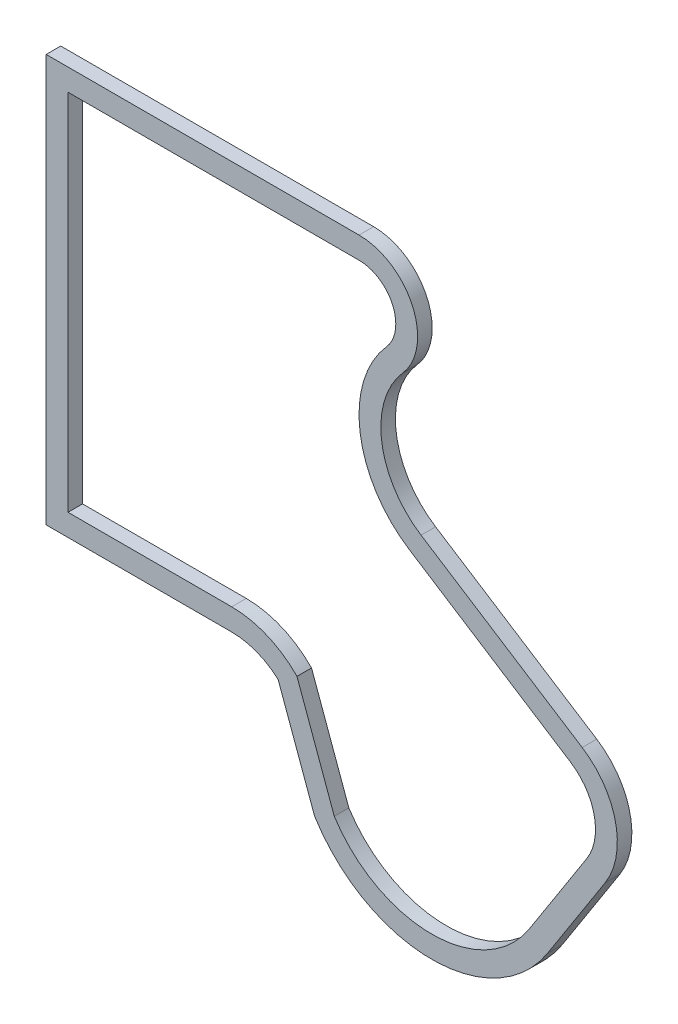
ISO-10303-21;
HEADER;
FILE_DESCRIPTION(('STEP AP214'),'2;1');
FILE_NAME('part.step','',(''),(''),'','','');
FILE_SCHEMA(('AUTOMOTIVE_DESIGN { 1 0 10303 214 1 1 1 1 }'));
ENDSEC;
DATA;
#1=APPLICATION_CONTEXT('core data for automotive mechanical design processes');
#2=APPLICATION_PROTOCOL_DEFINITION('international standard','automotive_design',2000,#1);
#3=PRODUCT_CONTEXT('',#1,'mechanical');
#4=PRODUCT('Part','Part','',(#3));
#5=PRODUCT_RELATED_PRODUCT_CATEGORY('part','',(#4));
#6=PRODUCT_DEFINITION_FORMATION('','',#4);
#7=PRODUCT_DEFINITION_CONTEXT('part definition',#1,'design');
#8=PRODUCT_DEFINITION('design','',#6,#7);
#9=PRODUCT_DEFINITION_SHAPE('','',#8);
#10=(LENGTH_UNIT() NAMED_UNIT(*) SI_UNIT(.MILLI.,.METRE.));
#11=(NAMED_UNIT(*) PLANE_ANGLE_UNIT() SI_UNIT($,.RADIAN.));
#12=(NAMED_UNIT(*) SI_UNIT($,.STERADIAN.) SOLID_ANGLE_UNIT());
#13=UNCERTAINTY_MEASURE_WITH_UNIT(LENGTH_MEASURE(1.E-05),#10,'distance_accuracy_value','');
#14=(GEOMETRIC_REPRESENTATION_CONTEXT(3) GLOBAL_UNCERTAINTY_ASSIGNED_CONTEXT((#13)) GLOBAL_UNIT_ASSIGNED_CONTEXT((#10,
#11,#12)) REPRESENTATION_CONTEXT('',''));
#15=CARTESIAN_POINT('',(0.,0.,0.));
#16=DIRECTION('',(0.,0.,1.));
#17=DIRECTION('',(1.,0.,0.));
#18=AXIS2_PLACEMENT_3D('',#15,#16,#17);
#19=CARTESIAN_POINT('',(57.15,-31.75,5.08));
#20=DIRECTION('',(0.,0.,-1.));
#21=DIRECTION('',(-1.,0.,0.));
#22=AXIS2_PLACEMENT_3D('',#19,#20,#21);
#23=PLANE('',#22);
#24=DIRECTION('',(1.,0.,0.));
#25=VECTOR('',#24,1.);
#26=CARTESIAN_POINT('',(-7.62,-7.62,5.08));
#27=LINE('',#26,#25);
#28=CARTESIAN_POINT('',(-7.62,-7.62,5.08));
#29=VERTEX_POINT('',#28);
#30=CARTESIAN_POINT('',(57.15,-7.62,5.08));
#31=VERTEX_POINT('',#30);
#32=EDGE_CURVE('E274',#29,#31,#27,.T.);
#33=ORIENTED_EDGE('',*,*,#32,.T.);
#34=CARTESIAN_POINT('',(57.15,-31.75,5.08));
#35=DIRECTION('',(0.,0.,-1.));
#36=DIRECTION('',(-1.,0.,0.));
#37=AXIS2_PLACEMENT_3D('',#34,#35,#36);
#38=CIRCLE('',#37,24.13);
#39=CARTESIAN_POINT('',(73.3701951159205,-13.8848895776861,5.08));
#40=VERTEX_POINT('',#39);
#41=EDGE_CURVE('E277',#31,#40,#38,.T.);
#42=ORIENTED_EDGE('',*,*,#41,.T.);
#43=DIRECTION('',(0.342020143325669,-0.939692620785908,0.));
#44=VECTOR('',#43,1.);
#45=CARTESIAN_POINT('',(73.3701951159205,-13.8848895776861,5.08));
#46=LINE('',#45,#44);
#47=CARTESIAN_POINT('',(86.0802479004247,-48.8054726031877,5.08));
#48=VERTEX_POINT('',#47);
#49=EDGE_CURVE('E280',#40,#48,#46,.T.);
#50=ORIENTED_EDGE('',*,*,#49,.T.);
#51=CARTESIAN_POINT('',(127.,-23.6138442919467,5.08));
#52=DIRECTION('',(0.,0.,1.));
#53=DIRECTION('',(1.,0.,0.));
#54=AXIS2_PLACEMENT_3D('',#51,#52,#53);
#55=CIRCLE('',#54,48.0525155310564);
#56=CARTESIAN_POINT('',(167.450498741756,-49.552259825776,5.08));
#57=VERTEX_POINT('',#56);
#58=EDGE_CURVE('E282',#48,#57,#55,.T.);
#59=ORIENTED_EDGE('',*,*,#58,.T.);
#60=DIRECTION('',(0.539793083612144,0.84179773513861,0.));
#61=VECTOR('',#60,1.);
#62=CARTESIAN_POINT('',(167.450498741756,-49.552259825776,5.08));
#63=LINE('',#62,#61);
#64=CARTESIAN_POINT('',(187.550745596147,-18.2062815399359,5.08));
#65=VERTEX_POINT('',#64);
#66=EDGE_CURVE('E284',#57,#65,#63,.T.);
#67=ORIENTED_EDGE('',*,*,#66,.T.);
#68=CARTESIAN_POINT('',(165.1,-3.81000000000001,5.08));
#69=DIRECTION('',(0.,0.,1.));
#70=DIRECTION('',(-1.,0.,0.));
#71=AXIS2_PLACEMENT_3D('',#68,#69,#70);
#72=CIRCLE('',#71,26.67);
#73=CARTESIAN_POINT('',(179.496281539936,18.6407455961467,5.08));
#74=VERTEX_POINT('',#73);
#75=EDGE_CURVE('E286',#65,#74,#72,.T.);
#76=ORIENTED_EDGE('',*,*,#75,.T.);
#77=DIRECTION('',(-0.84179773513861,0.539793083612144,0.));
#78=VECTOR('',#77,1.);
#79=CARTESIAN_POINT('',(123.247106811502,54.7098797953497,5.08));
#80=LINE('',#79,#78);
#81=CARTESIAN_POINT('',(123.247106811502,54.7098797953497,5.08));
#82=VERTEX_POINT('',#81);
#83=EDGE_CURVE('E288',#74,#82,#80,.T.);
#84=ORIENTED_EDGE('',*,*,#83,.T.);
#85=CARTESIAN_POINT('',(139.7,80.3678747623745,5.08));
#86=DIRECTION('',(0.,0.,-1.));
#87=DIRECTION('',(1.,0.,0.));
#88=AXIS2_PLACEMENT_3D('',#85,#86,#87);
#89=CIRCLE('',#88,30.48);
#90=CARTESIAN_POINT('',(116.899219219543,100.595449896373,5.08));
#91=VERTEX_POINT('',#90);
#92=EDGE_CURVE('E290',#82,#91,#89,.T.);
#93=ORIENTED_EDGE('',*,*,#92,.T.);
#94=CARTESIAN_POINT('',(101.6,114.168059941379,5.08));
#95=DIRECTION('',(0.,0.,1.));
#96=DIRECTION('',(-1.,0.,0.));
#97=AXIS2_PLACEMENT_3D('',#94,#95,#96);
#98=CIRCLE('',#97,20.4519400586212);
#99=CARTESIAN_POINT('',(101.6,134.62,5.08));
#100=VERTEX_POINT('',#99);
#101=EDGE_CURVE('E292',#91,#100,#98,.T.);
#102=ORIENTED_EDGE('',*,*,#101,.T.);
#103=DIRECTION('',(-1.,0.,0.));
#104=VECTOR('',#103,1.);
#105=CARTESIAN_POINT('',(-7.62,134.62,5.08));
#106=LINE('',#105,#104);
#107=CARTESIAN_POINT('',(-7.62,134.62,5.08));
#108=VERTEX_POINT('',#107);
#109=EDGE_CURVE('E294',#100,#108,#106,.T.);
#110=ORIENTED_EDGE('',*,*,#109,.T.);
#111=DIRECTION('',(0.,-1.,0.));
#112=VECTOR('',#111,1.);
#113=CARTESIAN_POINT('',(-7.62,-7.62,5.08));
#114=LINE('',#113,#112);
#115=EDGE_CURVE('E296',#108,#29,#114,.T.);
#116=ORIENTED_EDGE('',*,*,#115,.T.);
#117=EDGE_LOOP('',(#33,#42,#50,#59,#67,#76,#84,#93,#102,#110,#116));
#118=FACE_BOUND('',#117,.T.);
#119=DIRECTION('',(1.,0.,0.));
#120=VECTOR('',#119,1.);
#121=CARTESIAN_POINT('',(0.,0.,5.08));
#122=LINE('',#121,#120);
#123=CARTESIAN_POINT('',(0.,0.,5.08));
#124=VERTEX_POINT('',#123);
#125=CARTESIAN_POINT('',(57.15,0.,5.08));
#126=VERTEX_POINT('',#125);
#127=EDGE_CURVE('E188',#124,#126,#122,.T.);
#128=ORIENTED_EDGE('',*,*,#127,.F.);
#129=DIRECTION('',(0.,-1.,0.));
#130=VECTOR('',#129,1.);
#131=CARTESIAN_POINT('',(0.,0.,5.08));
#132=LINE('',#131,#130);
#133=CARTESIAN_POINT('',(0.,127.,5.08));
#134=VERTEX_POINT('',#133);
#135=EDGE_CURVE('E227',#134,#124,#132,.T.);
#136=ORIENTED_EDGE('',*,*,#135,.F.);
#137=DIRECTION('',(-1.,0.,0.));
#138=VECTOR('',#137,1.);
#139=CARTESIAN_POINT('',(0.,127.,5.08));
#140=LINE('',#139,#138);
#141=CARTESIAN_POINT('',(101.6,127.,5.08));
#142=VERTEX_POINT('',#141);
#143=EDGE_CURVE('E225',#142,#134,#140,.T.);
#144=ORIENTED_EDGE('',*,*,#143,.F.);
#145=CARTESIAN_POINT('',(101.6,114.168059941379,5.08));
#146=DIRECTION('',(0.,0.,1.));
#147=DIRECTION('',(-1.,0.,0.));
#148=AXIS2_PLACEMENT_3D('',#145,#146,#147);
#149=CIRCLE('',#148,12.8319400586212);
#150=CARTESIAN_POINT('',(111.199024024429,105.652343679872,5.08));
#151=VERTEX_POINT('',#150);
#152=EDGE_CURVE('E223',#151,#142,#149,.T.);
#153=ORIENTED_EDGE('',*,*,#152,.F.);
#154=CARTESIAN_POINT('',(139.7,80.3678747623745,5.08));
#155=DIRECTION('',(0.,0.,-1.));
#156=DIRECTION('',(1.,0.,0.));
#157=AXIS2_PLACEMENT_3D('',#154,#155,#156);
#158=CIRCLE('',#157,38.1);
#159=CARTESIAN_POINT('',(119.133883514377,48.2953810535935,5.08));
#160=VERTEX_POINT('',#159);
#161=EDGE_CURVE('E221',#160,#151,#158,.T.);
#162=ORIENTED_EDGE('',*,*,#161,.F.);
#163=DIRECTION('',(-0.84179773513861,0.539793083612144,0.));
#164=VECTOR('',#163,1.);
#165=CARTESIAN_POINT('',(119.133883514377,48.2953810535935,5.08));
#166=LINE('',#165,#164);
#167=CARTESIAN_POINT('',(175.383058242811,12.2262468543905,5.08));
#168=VERTEX_POINT('',#167);
#169=EDGE_CURVE('E219',#168,#160,#166,.T.);
#170=ORIENTED_EDGE('',*,*,#169,.F.);
#171=CARTESIAN_POINT('',(165.1,-3.81000000000001,5.08));
#172=DIRECTION('',(0.,0.,1.));
#173=DIRECTION('',(-1.,0.,0.));
#174=AXIS2_PLACEMENT_3D('',#171,#172,#173);
#175=CIRCLE('',#174,19.05);
#176=CARTESIAN_POINT('',(181.136246854391,-14.0930582428113,5.08));
#177=VERTEX_POINT('',#176);
#178=EDGE_CURVE('E217',#177,#168,#175,.T.);
#179=ORIENTED_EDGE('',*,*,#178,.F.);
#180=DIRECTION('',(0.539793083612144,0.84179773513861,0.));
#181=VECTOR('',#180,1.);
#182=CARTESIAN_POINT('',(161.036,-45.4390365286515,5.08));
#183=LINE('',#182,#181);
#184=CARTESIAN_POINT('',(161.036,-45.4390365286515,5.08));
#185=VERTEX_POINT('',#184);
#186=EDGE_CURVE('E215',#185,#177,#183,.T.);
#187=ORIENTED_EDGE('',*,*,#186,.F.);
#188=CARTESIAN_POINT('',(127.,-23.6138442919467,5.08));
#189=DIRECTION('',(0.,0.,1.));
#190=DIRECTION('',(1.,0.,0.));
#191=AXIS2_PLACEMENT_3D('',#188,#189,#190);
#192=CIRCLE('',#191,40.4325155310564);
#193=CARTESIAN_POINT('',(92.964,-45.4390365286515,5.08));
#194=VERTEX_POINT('',#193);
#195=EDGE_CURVE('E211',#194,#185,#192,.T.);
#196=ORIENTED_EDGE('',*,*,#195,.F.);
#197=DIRECTION('',(0.342020143325669,-0.939692620785908,0.));
#198=VECTOR('',#197,1.);
#199=CARTESIAN_POINT('',(79.933032539292,-9.63674767670839,5.08));
#200=LINE('',#199,#198);
#201=CARTESIAN_POINT('',(79.933032539292,-9.63674767670839,5.08));
#202=VERTEX_POINT('',#201);
#203=EDGE_CURVE('E209',#202,#194,#200,.T.);
#204=ORIENTED_EDGE('',*,*,#203,.F.);
#205=CARTESIAN_POINT('',(57.15,-31.75,5.08));
#206=DIRECTION('',(0.,0.,-1.));
#207=DIRECTION('',(-1.,0.,0.));
#208=AXIS2_PLACEMENT_3D('',#205,#206,#207);
#209=CIRCLE('',#208,31.75);
#210=EDGE_CURVE('E196',#126,#202,#209,.T.);
#211=ORIENTED_EDGE('',*,*,#210,.F.);
#212=EDGE_LOOP('',(#128,#136,#144,#153,#162,#170,#179,#187,#196,#204,#211));
#213=FACE_BOUND('',#212,.T.);
#214=ADVANCED_FACE('F39',(#118,#213),#23,.F.);
#215=CARTESIAN_POINT('',(57.15,-31.75,0.));
#216=DIRECTION('',(0.,0.,-1.));
#217=DIRECTION('',(-1.,0.,0.));
#218=AXIS2_PLACEMENT_3D('',#215,#216,#217);
#219=PLANE('',#218);
#220=DIRECTION('',(1.,0.,0.));
#221=VECTOR('',#220,1.);
#222=CARTESIAN_POINT('',(-7.62,-7.62,0.));
#223=LINE('',#222,#221);
#224=CARTESIAN_POINT('',(-7.62,-7.62,0.));
#225=VERTEX_POINT('',#224);
#226=CARTESIAN_POINT('',(57.15,-7.62,0.));
#227=VERTEX_POINT('',#226);
#228=EDGE_CURVE('E204',#225,#227,#223,.T.);
#229=ORIENTED_EDGE('',*,*,#228,.F.);
#230=DIRECTION('',(0.,-1.,0.));
#231=VECTOR('',#230,1.);
#232=CARTESIAN_POINT('',(-7.62,-7.62,0.));
#233=LINE('',#232,#231);
#234=CARTESIAN_POINT('',(-7.62,134.62,0.));
#235=VERTEX_POINT('',#234);
#236=EDGE_CURVE('E278',#235,#225,#233,.T.);
#237=ORIENTED_EDGE('',*,*,#236,.F.);
#238=DIRECTION('',(-1.,0.,0.));
#239=VECTOR('',#238,1.);
#240=CARTESIAN_POINT('',(-7.62,134.62,0.));
#241=LINE('',#240,#239);
#242=CARTESIAN_POINT('',(101.6,134.62,0.));
#243=VERTEX_POINT('',#242);
#244=EDGE_CURVE('E317',#243,#235,#241,.T.);
#245=ORIENTED_EDGE('',*,*,#244,.F.);
#246=CARTESIAN_POINT('',(101.6,114.168059941379,0.));
#247=DIRECTION('',(0.,0.,1.));
#248=DIRECTION('',(-1.,0.,0.));
#249=AXIS2_PLACEMENT_3D('',#246,#247,#248);
#250=CIRCLE('',#249,20.4519400586212);
#251=CARTESIAN_POINT('',(116.899219219543,100.595449896373,0.));
#252=VERTEX_POINT('',#251);
#253=EDGE_CURVE('E315',#252,#243,#250,.T.);
#254=ORIENTED_EDGE('',*,*,#253,.F.);
#255=CARTESIAN_POINT('',(139.7,80.3678747623745,0.));
#256=DIRECTION('',(0.,0.,-1.));
#257=DIRECTION('',(1.,0.,0.));
#258=AXIS2_PLACEMENT_3D('',#255,#256,#257);
#259=CIRCLE('',#258,30.48);
#260=CARTESIAN_POINT('',(123.247106811502,54.7098797953497,0.));
#261=VERTEX_POINT('',#260);
#262=EDGE_CURVE('E313',#261,#252,#259,.T.);
#263=ORIENTED_EDGE('',*,*,#262,.F.);
#264=DIRECTION('',(-0.84179773513861,0.539793083612144,0.));
#265=VECTOR('',#264,1.);
#266=CARTESIAN_POINT('',(123.247106811502,54.7098797953497,0.));
#267=LINE('',#266,#265);
#268=CARTESIAN_POINT('',(179.496281539936,18.6407455961467,0.));
#269=VERTEX_POINT('',#268);
#270=EDGE_CURVE('E311',#269,#261,#267,.T.);
#271=ORIENTED_EDGE('',*,*,#270,.F.);
#272=CARTESIAN_POINT('',(165.1,-3.81000000000001,0.));
#273=DIRECTION('',(0.,0.,1.));
#274=DIRECTION('',(-1.,0.,0.));
#275=AXIS2_PLACEMENT_3D('',#272,#273,#274);
#276=CIRCLE('',#275,26.67);
#277=CARTESIAN_POINT('',(187.550745596147,-18.2062815399359,0.));
#278=VERTEX_POINT('',#277);
#279=EDGE_CURVE('E309',#278,#269,#276,.T.);
#280=ORIENTED_EDGE('',*,*,#279,.F.);
#281=DIRECTION('',(0.539793083612144,0.84179773513861,0.));
#282=VECTOR('',#281,1.);
#283=CARTESIAN_POINT('',(167.450498741756,-49.552259825776,0.));
#284=LINE('',#283,#282);
#285=CARTESIAN_POINT('',(167.450498741756,-49.552259825776,0.));
#286=VERTEX_POINT('',#285);
#287=EDGE_CURVE('E307',#286,#278,#284,.T.);
#288=ORIENTED_EDGE('',*,*,#287,.F.);
#289=CARTESIAN_POINT('',(127.,-23.6138442919467,0.));
#290=DIRECTION('',(0.,0.,1.));
#291=DIRECTION('',(1.,0.,0.));
#292=AXIS2_PLACEMENT_3D('',#289,#290,#291);
#293=CIRCLE('',#292,48.0525155310564);
#294=CARTESIAN_POINT('',(86.0802479004247,-48.8054726031877,0.));
#295=VERTEX_POINT('',#294);
#296=EDGE_CURVE('E305',#295,#286,#293,.T.);
#297=ORIENTED_EDGE('',*,*,#296,.F.);
#298=DIRECTION('',(0.342020143325669,-0.939692620785908,0.));
#299=VECTOR('',#298,1.);
#300=CARTESIAN_POINT('',(73.3701951159205,-13.8848895776861,0.));
#301=LINE('',#300,#299);
#302=CARTESIAN_POINT('',(73.3701951159205,-13.8848895776861,0.));
#303=VERTEX_POINT('',#302);
#304=EDGE_CURVE('E303',#303,#295,#301,.T.);
#305=ORIENTED_EDGE('',*,*,#304,.F.);
#306=CARTESIAN_POINT('',(57.15,-31.75,0.));
#307=DIRECTION('',(0.,0.,-1.));
#308=DIRECTION('',(-1.,0.,0.));
#309=AXIS2_PLACEMENT_3D('',#306,#307,#308);
#310=CIRCLE('',#309,24.13);
#311=EDGE_CURVE('E301',#227,#303,#310,.T.);
#312=ORIENTED_EDGE('',*,*,#311,.F.);
#313=EDGE_LOOP('',(#229,#237,#245,#254,#263,#271,#280,#288,#297,#305,#312));
#314=FACE_BOUND('',#313,.T.);
#315=DIRECTION('',(0.,-1.,0.));
#316=VECTOR('',#315,1.);
#317=CARTESIAN_POINT('',(0.,0.,0.));
#318=LINE('',#317,#316);
#319=CARTESIAN_POINT('',(0.,127.,0.));
#320=VERTEX_POINT('',#319);
#321=CARTESIAN_POINT('',(0.,0.,0.));
#322=VERTEX_POINT('',#321);
#323=EDGE_CURVE('E197',#320,#322,#318,.T.);
#324=ORIENTED_EDGE('',*,*,#323,.T.);
#325=DIRECTION('',(1.,0.,0.));
#326=VECTOR('',#325,1.);
#327=CARTESIAN_POINT('',(0.,0.,0.));
#328=LINE('',#327,#326);
#329=CARTESIAN_POINT('',(57.15,0.,0.));
#330=VERTEX_POINT('',#329);
#331=EDGE_CURVE('E62',#322,#330,#328,.T.);
#332=ORIENTED_EDGE('',*,*,#331,.T.);
#333=CARTESIAN_POINT('',(57.15,-31.75,0.));
#334=DIRECTION('',(0.,0.,-1.));
#335=DIRECTION('',(-1.,0.,0.));
#336=AXIS2_PLACEMENT_3D('',#333,#334,#335);
#337=CIRCLE('',#336,31.75);
#338=CARTESIAN_POINT('',(79.933032539292,-9.63674767670839,0.));
#339=VERTEX_POINT('',#338);
#340=EDGE_CURVE('E203',#330,#339,#337,.T.);
#341=ORIENTED_EDGE('',*,*,#340,.T.);
#342=DIRECTION('',(0.342020143325669,-0.939692620785908,0.));
#343=VECTOR('',#342,1.);
#344=CARTESIAN_POINT('',(79.933032539292,-9.63674767670839,0.));
#345=LINE('',#344,#343);
#346=CARTESIAN_POINT('',(92.964,-45.4390365286515,0.));
#347=VERTEX_POINT('',#346);
#348=EDGE_CURVE('E231',#339,#347,#345,.T.);
#349=ORIENTED_EDGE('',*,*,#348,.T.);
#350=CARTESIAN_POINT('',(127.,-23.6138442919467,0.));
#351=DIRECTION('',(0.,0.,1.));
#352=DIRECTION('',(1.,0.,0.));
#353=AXIS2_PLACEMENT_3D('',#350,#351,#352);
#354=CIRCLE('',#353,40.4325155310564);
#355=CARTESIAN_POINT('',(161.036,-45.4390365286515,0.));
#356=VERTEX_POINT('',#355);
#357=EDGE_CURVE('E234',#347,#356,#354,.T.);
#358=ORIENTED_EDGE('',*,*,#357,.T.);
#359=DIRECTION('',(0.539793083612144,0.84179773513861,0.));
#360=VECTOR('',#359,1.);
#361=CARTESIAN_POINT('',(161.036,-45.4390365286515,0.));
#362=LINE('',#361,#360);
#363=CARTESIAN_POINT('',(181.136246854391,-14.0930582428113,0.));
#364=VERTEX_POINT('',#363);
#365=EDGE_CURVE('E237',#356,#364,#362,.T.);
#366=ORIENTED_EDGE('',*,*,#365,.T.);
#367=CARTESIAN_POINT('',(165.1,-3.81000000000001,0.));
#368=DIRECTION('',(0.,0.,1.));
#369=DIRECTION('',(-1.,0.,0.));
#370=AXIS2_PLACEMENT_3D('',#367,#368,#369);
#371=CIRCLE('',#370,19.05);
#372=CARTESIAN_POINT('',(175.383058242811,12.2262468543905,0.));
#373=VERTEX_POINT('',#372);
#374=EDGE_CURVE('E240',#364,#373,#371,.T.);
#375=ORIENTED_EDGE('',*,*,#374,.T.);
#376=DIRECTION('',(-0.84179773513861,0.539793083612144,0.));
#377=VECTOR('',#376,1.);
#378=CARTESIAN_POINT('',(119.133883514377,48.2953810535935,0.));
#379=LINE('',#378,#377);
#380=CARTESIAN_POINT('',(119.133883514377,48.2953810535935,0.));
#381=VERTEX_POINT('',#380);
#382=EDGE_CURVE('E243',#373,#381,#379,.T.);
#383=ORIENTED_EDGE('',*,*,#382,.T.);
#384=CARTESIAN_POINT('',(139.7,80.3678747623745,0.));
#385=DIRECTION('',(0.,0.,-1.));
#386=DIRECTION('',(1.,0.,0.));
#387=AXIS2_PLACEMENT_3D('',#384,#385,#386);
#388=CIRCLE('',#387,38.1);
#389=CARTESIAN_POINT('',(111.199024024429,105.652343679872,0.));
#390=VERTEX_POINT('',#389);
#391=EDGE_CURVE('E246',#381,#390,#388,.T.);
#392=ORIENTED_EDGE('',*,*,#391,.T.);
#393=CARTESIAN_POINT('',(101.6,114.168059941379,0.));
#394=DIRECTION('',(0.,0.,1.));
#395=DIRECTION('',(-1.,0.,0.));
#396=AXIS2_PLACEMENT_3D('',#393,#394,#395);
#397=CIRCLE('',#396,12.8319400586212);
#398=CARTESIAN_POINT('',(101.6,127.,0.));
#399=VERTEX_POINT('',#398);
#400=EDGE_CURVE('E249',#390,#399,#397,.T.);
#401=ORIENTED_EDGE('',*,*,#400,.T.);
#402=DIRECTION('',(-1.,0.,0.));
#403=VECTOR('',#402,1.);
#404=CARTESIAN_POINT('',(0.,127.,0.));
#405=LINE('',#404,#403);
#406=EDGE_CURVE('E252',#399,#320,#405,.T.);
#407=ORIENTED_EDGE('',*,*,#406,.T.);
#408=EDGE_LOOP('',(#324,#332,#341,#349,#358,#366,#375,#383,#392,#401,#407));
#409=FACE_BOUND('',#408,.T.);
#410=ADVANCED_FACE('F356',(#314,#409),#219,.T.);
#411=CARTESIAN_POINT('',(-7.62,-7.62,5.08));
#412=DIRECTION('',(0.,1.,0.));
#413=DIRECTION('',(-1.,0.,0.));
#414=AXIS2_PLACEMENT_3D('',#411,#412,#413);
#415=PLANE('',#414);
#416=ORIENTED_EDGE('',*,*,#228,.T.);
#417=DIRECTION('',(0.,0.,-1.));
#418=VECTOR('',#417,1.);
#419=CARTESIAN_POINT('',(57.15,-7.62,5.08));
#420=LINE('',#419,#418);
#421=EDGE_CURVE('E11',#31,#227,#420,.T.);
#422=ORIENTED_EDGE('',*,*,#421,.F.);
#423=ORIENTED_EDGE('',*,*,#32,.F.);
#424=DIRECTION('',(0.,0.,-1.));
#425=VECTOR('',#424,1.);
#426=CARTESIAN_POINT('',(-7.62,-7.62,5.08));
#427=LINE('',#426,#425);
#428=EDGE_CURVE('E298',#29,#225,#427,.T.);
#429=ORIENTED_EDGE('',*,*,#428,.T.);
#430=EDGE_LOOP('',(#416,#422,#423,#429));
#431=FACE_BOUND('',#430,.T.);
#432=ADVANCED_FACE('F41',(#431),#415,.F.);
#433=CARTESIAN_POINT('',(57.15,-31.75,5.08));
#434=DIRECTION('',(0.,0.,-1.));
#435=DIRECTION('',(-1.,0.,0.));
#436=AXIS2_PLACEMENT_3D('',#433,#434,#435);
#437=CYLINDRICAL_SURFACE('',#436,24.13);
#438=ORIENTED_EDGE('',*,*,#311,.T.);
#439=DIRECTION('',(0.,0.,-1.));
#440=VECTOR('',#439,1.);
#441=CARTESIAN_POINT('',(73.3701951159205,-13.8848895776861,5.08));
#442=LINE('',#441,#440);
#443=EDGE_CURVE('E47',#40,#303,#442,.T.);
#444=ORIENTED_EDGE('',*,*,#443,.F.);
#445=ORIENTED_EDGE('',*,*,#41,.F.);
#446=ORIENTED_EDGE('',*,*,#421,.T.);
#447=EDGE_LOOP('',(#438,#444,#445,#446));
#448=FACE_BOUND('',#447,.T.);
#449=ADVANCED_FACE('F373',(#448),#437,.F.);
#450=CARTESIAN_POINT('',(73.3701951159205,-13.8848895776861,5.08));
#451=DIRECTION('',(0.939692620785908,0.342020143325669,0.));
#452=DIRECTION('',(-0.342020143325669,0.939692620785908,0.));
#453=AXIS2_PLACEMENT_3D('',#450,#451,#452);
#454=PLANE('',#453);
#455=ORIENTED_EDGE('',*,*,#304,.T.);
#456=DIRECTION('',(0.,0.,-1.));
#457=VECTOR('',#456,1.);
#458=CARTESIAN_POINT('',(86.0802479004247,-48.8054726031877,5.08));
#459=LINE('',#458,#457);
#460=EDGE_CURVE('E343',#48,#295,#459,.T.);
#461=ORIENTED_EDGE('',*,*,#460,.F.);
#462=ORIENTED_EDGE('',*,*,#49,.F.);
#463=ORIENTED_EDGE('',*,*,#443,.T.);
#464=EDGE_LOOP('',(#455,#461,#462,#463));
#465=FACE_BOUND('',#464,.T.);
#466=ADVANCED_FACE('F350',(#465),#454,.F.);
#467=CARTESIAN_POINT('',(127.,-23.6138442919467,5.08));
#468=DIRECTION('',(0.,0.,-1.));
#469=DIRECTION('',(-1.,0.,0.));
#470=AXIS2_PLACEMENT_3D('',#467,#468,#469);
#471=CYLINDRICAL_SURFACE('',#470,48.0525155310564);
#472=ORIENTED_EDGE('',*,*,#296,.T.);
#473=DIRECTION('',(0.,0.,-1.));
#474=VECTOR('',#473,1.);
#475=CARTESIAN_POINT('',(167.450498741756,-49.552259825776,5.08));
#476=LINE('',#475,#474);
#477=EDGE_CURVE('E340',#57,#286,#476,.T.);
#478=ORIENTED_EDGE('',*,*,#477,.F.);
#479=ORIENTED_EDGE('',*,*,#58,.F.);
#480=ORIENTED_EDGE('',*,*,#460,.T.);
#481=EDGE_LOOP('',(#472,#478,#479,#480));
#482=FACE_BOUND('',#481,.T.);
#483=ADVANCED_FACE('F362',(#482),#471,.T.);
#484=CARTESIAN_POINT('',(167.450498741756,-49.552259825776,5.08));
#485=DIRECTION('',(-0.84179773513861,0.539793083612144,0.));
#486=DIRECTION('',(-0.539793083612144,-0.84179773513861,0.));
#487=AXIS2_PLACEMENT_3D('',#484,#485,#486);
#488=PLANE('',#487);
#489=ORIENTED_EDGE('',*,*,#287,.T.);
#490=DIRECTION('',(0.,0.,-1.));
#491=VECTOR('',#490,1.);
#492=CARTESIAN_POINT('',(187.550745596147,-18.2062815399359,5.08));
#493=LINE('',#492,#491);
#494=EDGE_CURVE('E337',#65,#278,#493,.T.);
#495=ORIENTED_EDGE('',*,*,#494,.F.);
#496=ORIENTED_EDGE('',*,*,#66,.F.);
#497=ORIENTED_EDGE('',*,*,#477,.T.);
#498=EDGE_LOOP('',(#489,#495,#496,#497));
#499=FACE_BOUND('',#498,.T.);
#500=ADVANCED_FACE('F366',(#499),#488,.F.);
#501=CARTESIAN_POINT('',(165.1,-3.81000000000001,5.08));
#502=DIRECTION('',(0.,0.,-1.));
#503=DIRECTION('',(-1.,0.,0.));
#504=AXIS2_PLACEMENT_3D('',#501,#502,#503);
#505=CYLINDRICAL_SURFACE('',#504,26.67);
#506=ORIENTED_EDGE('',*,*,#279,.T.);
#507=DIRECTION('',(0.,0.,-1.));
#508=VECTOR('',#507,1.);
#509=CARTESIAN_POINT('',(179.496281539936,18.6407455961467,5.08));
#510=LINE('',#509,#508);
#511=EDGE_CURVE('E334',#74,#269,#510,.T.);
#512=ORIENTED_EDGE('',*,*,#511,.F.);
#513=ORIENTED_EDGE('',*,*,#75,.F.);
#514=ORIENTED_EDGE('',*,*,#494,.T.);
#515=EDGE_LOOP('',(#506,#512,#513,#514));
#516=FACE_BOUND('',#515,.T.);
#517=ADVANCED_FACE('F401',(#516),#505,.T.);
#518=CARTESIAN_POINT('',(123.247106811502,54.7098797953497,5.08));
#519=DIRECTION('',(-0.539793083612144,-0.84179773513861,0.));
#520=DIRECTION('',(0.84179773513861,-0.539793083612144,0.));
#521=AXIS2_PLACEMENT_3D('',#518,#519,#520);
#522=PLANE('',#521);
#523=ORIENTED_EDGE('',*,*,#270,.T.);
#524=DIRECTION('',(0.,0.,-1.));
#525=VECTOR('',#524,1.);
#526=CARTESIAN_POINT('',(123.247106811502,54.7098797953497,5.08));
#527=LINE('',#526,#525);
#528=EDGE_CURVE('E331',#82,#261,#527,.T.);
#529=ORIENTED_EDGE('',*,*,#528,.F.);
#530=ORIENTED_EDGE('',*,*,#83,.F.);
#531=ORIENTED_EDGE('',*,*,#511,.T.);
#532=EDGE_LOOP('',(#523,#529,#530,#531));
#533=FACE_BOUND('',#532,.T.);
#534=ADVANCED_FACE('F399',(#533),#522,.F.);
#535=CARTESIAN_POINT('',(139.7,80.3678747623745,5.08));
#536=DIRECTION('',(0.,0.,-1.));
#537=DIRECTION('',(-1.,0.,0.));
#538=AXIS2_PLACEMENT_3D('',#535,#536,#537);
#539=CYLINDRICAL_SURFACE('',#538,30.48);
#540=ORIENTED_EDGE('',*,*,#262,.T.);
#541=DIRECTION('',(0.,0.,-1.));
#542=VECTOR('',#541,1.);
#543=CARTESIAN_POINT('',(116.899219219543,100.595449896373,5.08));
#544=LINE('',#543,#542);
#545=EDGE_CURVE('E328',#91,#252,#544,.T.);
#546=ORIENTED_EDGE('',*,*,#545,.F.);
#547=ORIENTED_EDGE('',*,*,#92,.F.);
#548=ORIENTED_EDGE('',*,*,#528,.T.);
#549=EDGE_LOOP('',(#540,#546,#547,#548));
#550=FACE_BOUND('',#549,.T.);
#551=ADVANCED_FACE('F394',(#550),#539,.F.);
#552=CARTESIAN_POINT('',(101.6,114.168059941379,5.08));
#553=DIRECTION('',(0.,0.,-1.));
#554=DIRECTION('',(-1.,0.,0.));
#555=AXIS2_PLACEMENT_3D('',#552,#553,#554);
#556=CYLINDRICAL_SURFACE('',#555,20.4519400586212);
#557=ORIENTED_EDGE('',*,*,#253,.T.);
#558=DIRECTION('',(0.,0.,-1.));
#559=VECTOR('',#558,1.);
#560=CARTESIAN_POINT('',(101.6,134.62,5.08));
#561=LINE('',#560,#559);
#562=EDGE_CURVE('E325',#100,#243,#561,.T.);
#563=ORIENTED_EDGE('',*,*,#562,.F.);
#564=ORIENTED_EDGE('',*,*,#101,.F.);
#565=ORIENTED_EDGE('',*,*,#545,.T.);
#566=EDGE_LOOP('',(#557,#563,#564,#565));
#567=FACE_BOUND('',#566,.T.);
#568=ADVANCED_FACE('F389',(#567),#556,.T.);
#569=CARTESIAN_POINT('',(-7.62,134.62,5.08));
#570=DIRECTION('',(0.,-1.,0.));
#571=DIRECTION('',(0.,0.,-1.));
#572=AXIS2_PLACEMENT_3D('',#569,#570,#571);
#573=PLANE('',#572);
#574=ORIENTED_EDGE('',*,*,#244,.T.);
#575=DIRECTION('',(0.,0.,-1.));
#576=VECTOR('',#575,1.);
#577=CARTESIAN_POINT('',(-7.62,134.62,5.08));
#578=LINE('',#577,#576);
#579=EDGE_CURVE('E322',#108,#235,#578,.T.);
#580=ORIENTED_EDGE('',*,*,#579,.F.);
#581=ORIENTED_EDGE('',*,*,#109,.F.);
#582=ORIENTED_EDGE('',*,*,#562,.T.);
#583=EDGE_LOOP('',(#574,#580,#581,#582));
#584=FACE_BOUND('',#583,.T.);
#585=ADVANCED_FACE('F385',(#584),#573,.F.);
#586=CARTESIAN_POINT('',(-7.62,-7.62,5.08));
#587=DIRECTION('',(1.,0.,0.));
#588=DIRECTION('',(0.,0.,-1.));
#589=AXIS2_PLACEMENT_3D('',#586,#587,#588);
#590=PLANE('',#589);
#591=ORIENTED_EDGE('',*,*,#236,.T.);
#592=ORIENTED_EDGE('',*,*,#428,.F.);
#593=ORIENTED_EDGE('',*,*,#115,.F.);
#594=ORIENTED_EDGE('',*,*,#579,.T.);
#595=EDGE_LOOP('',(#591,#592,#593,#594));
#596=FACE_BOUND('',#595,.T.);
#597=ADVANCED_FACE('F380',(#596),#590,.F.);
#598=CARTESIAN_POINT('',(0.,0.,5.08));
#599=DIRECTION('',(0.,1.,0.));
#600=DIRECTION('',(0.,0.,1.));
#601=AXIS2_PLACEMENT_3D('',#598,#599,#600);
#602=PLANE('',#601);
#603=ORIENTED_EDGE('',*,*,#331,.F.);
#604=DIRECTION('',(0.,0.,-1.));
#605=VECTOR('',#604,1.);
#606=CARTESIAN_POINT('',(0.,0.,5.08));
#607=LINE('',#606,#605);
#608=EDGE_CURVE('E192',#124,#322,#607,.T.);
#609=ORIENTED_EDGE('',*,*,#608,.F.);
#610=ORIENTED_EDGE('',*,*,#127,.T.);
#611=DIRECTION('',(0.,0.,-1.));
#612=VECTOR('',#611,1.);
#613=CARTESIAN_POINT('',(57.15,0.,5.08));
#614=LINE('',#613,#612);
#615=EDGE_CURVE('E191',#126,#330,#614,.T.);
#616=ORIENTED_EDGE('',*,*,#615,.T.);
#617=EDGE_LOOP('',(#603,#609,#610,#616));
#618=FACE_BOUND('',#617,.T.);
#619=ADVANCED_FACE('F190',(#618),#602,.T.);
#620=CARTESIAN_POINT('',(57.15,-31.75,5.08));
#621=DIRECTION('',(0.,0.,-1.));
#622=DIRECTION('',(-1.,0.,0.));
#623=AXIS2_PLACEMENT_3D('',#620,#621,#622);
#624=CYLINDRICAL_SURFACE('',#623,31.75);
#625=ORIENTED_EDGE('',*,*,#340,.F.);
#626=ORIENTED_EDGE('',*,*,#615,.F.);
#627=ORIENTED_EDGE('',*,*,#210,.T.);
#628=DIRECTION('',(0.,0.,-1.));
#629=VECTOR('',#628,1.);
#630=CARTESIAN_POINT('',(79.933032539292,-9.63674767670839,5.08));
#631=LINE('',#630,#629);
#632=EDGE_CURVE('E205',#202,#339,#631,.T.);
#633=ORIENTED_EDGE('',*,*,#632,.T.);
#634=EDGE_LOOP('',(#625,#626,#627,#633));
#635=FACE_BOUND('',#634,.T.);
#636=ADVANCED_FACE('F200',(#635),#624,.T.);
#637=CARTESIAN_POINT('',(79.933032539292,-9.63674767670839,5.08));
#638=DIRECTION('',(0.939692620785908,0.342020143325669,0.));
#639=DIRECTION('',(-0.342020143325669,0.939692620785908,0.));
#640=AXIS2_PLACEMENT_3D('',#637,#638,#639);
#641=PLANE('',#640);
#642=ORIENTED_EDGE('',*,*,#348,.F.);
#643=ORIENTED_EDGE('',*,*,#632,.F.);
#644=ORIENTED_EDGE('',*,*,#203,.T.);
#645=DIRECTION('',(0.,0.,-1.));
#646=VECTOR('',#645,1.);
#647=CARTESIAN_POINT('',(92.964,-45.4390365286515,5.08));
#648=LINE('',#647,#646);
#649=EDGE_CURVE('E271',#194,#347,#648,.T.);
#650=ORIENTED_EDGE('',*,*,#649,.T.);
#651=EDGE_LOOP('',(#642,#643,#644,#650));
#652=FACE_BOUND('',#651,.T.);
#653=ADVANCED_FACE('F458',(#652),#641,.T.);
#654=CARTESIAN_POINT('',(127.,-23.6138442919467,5.08));
#655=DIRECTION('',(0.,0.,-1.));
#656=DIRECTION('',(-1.,0.,0.));
#657=AXIS2_PLACEMENT_3D('',#654,#655,#656);
#658=CYLINDRICAL_SURFACE('',#657,40.4325155310564);
#659=ORIENTED_EDGE('',*,*,#357,.F.);
#660=ORIENTED_EDGE('',*,*,#649,.F.);
#661=ORIENTED_EDGE('',*,*,#195,.T.);
#662=DIRECTION('',(0.,0.,-1.));
#663=VECTOR('',#662,1.);
#664=CARTESIAN_POINT('',(161.036,-45.4390365286515,5.08));
#665=LINE('',#664,#663);
#666=EDGE_CURVE('E269',#185,#356,#665,.T.);
#667=ORIENTED_EDGE('',*,*,#666,.T.);
#668=EDGE_LOOP('',(#659,#660,#661,#667));
#669=FACE_BOUND('',#668,.T.);
#670=ADVANCED_FACE('F465',(#669),#658,.F.);
#671=CARTESIAN_POINT('',(161.036,-45.4390365286515,5.08));
#672=DIRECTION('',(-0.84179773513861,0.539793083612144,0.));
#673=DIRECTION('',(-0.539793083612144,-0.84179773513861,0.));
#674=AXIS2_PLACEMENT_3D('',#671,#672,#673);
#675=PLANE('',#674);
#676=ORIENTED_EDGE('',*,*,#365,.F.);
#677=ORIENTED_EDGE('',*,*,#666,.F.);
#678=ORIENTED_EDGE('',*,*,#186,.T.);
#679=DIRECTION('',(0.,0.,-1.));
#680=VECTOR('',#679,1.);
#681=CARTESIAN_POINT('',(181.136246854391,-14.0930582428113,5.08));
#682=LINE('',#681,#680);
#683=EDGE_CURVE('E267',#177,#364,#682,.T.);
#684=ORIENTED_EDGE('',*,*,#683,.T.);
#685=EDGE_LOOP('',(#676,#677,#678,#684));
#686=FACE_BOUND('',#685,.T.);
#687=ADVANCED_FACE('F474',(#686),#675,.T.);
#688=CARTESIAN_POINT('',(165.1,-3.81000000000001,5.08));
#689=DIRECTION('',(0.,0.,-1.));
#690=DIRECTION('',(-1.,0.,0.));
#691=AXIS2_PLACEMENT_3D('',#688,#689,#690);
#692=CYLINDRICAL_SURFACE('',#691,19.05);
#693=ORIENTED_EDGE('',*,*,#374,.F.);
#694=ORIENTED_EDGE('',*,*,#683,.F.);
#695=ORIENTED_EDGE('',*,*,#178,.T.);
#696=DIRECTION('',(0.,0.,-1.));
#697=VECTOR('',#696,1.);
#698=CARTESIAN_POINT('',(175.383058242811,12.2262468543905,5.08));
#699=LINE('',#698,#697);
#700=EDGE_CURVE('E265',#168,#373,#699,.T.);
#701=ORIENTED_EDGE('',*,*,#700,.T.);
#702=EDGE_LOOP('',(#693,#694,#695,#701));
#703=FACE_BOUND('',#702,.T.);
#704=ADVANCED_FACE('F483',(#703),#692,.F.);
#705=CARTESIAN_POINT('',(119.133883514377,48.2953810535935,5.08));
#706=DIRECTION('',(-0.539793083612144,-0.84179773513861,0.));
#707=DIRECTION('',(0.84179773513861,-0.539793083612144,0.));
#708=AXIS2_PLACEMENT_3D('',#705,#706,#707);
#709=PLANE('',#708);
#710=ORIENTED_EDGE('',*,*,#382,.F.);
#711=ORIENTED_EDGE('',*,*,#700,.F.);
#712=ORIENTED_EDGE('',*,*,#169,.T.);
#713=DIRECTION('',(0.,0.,-1.));
#714=VECTOR('',#713,1.);
#715=CARTESIAN_POINT('',(119.133883514377,48.2953810535935,5.08));
#716=LINE('',#715,#714);
#717=EDGE_CURVE('E263',#160,#381,#716,.T.);
#718=ORIENTED_EDGE('',*,*,#717,.T.);
#719=EDGE_LOOP('',(#710,#711,#712,#718));
#720=FACE_BOUND('',#719,.T.);
#721=ADVANCED_FACE('F492',(#720),#709,.T.);
#722=CARTESIAN_POINT('',(139.7,80.3678747623745,5.08));
#723=DIRECTION('',(0.,0.,-1.));
#724=DIRECTION('',(-1.,0.,0.));
#725=AXIS2_PLACEMENT_3D('',#722,#723,#724);
#726=CYLINDRICAL_SURFACE('',#725,38.1);
#727=ORIENTED_EDGE('',*,*,#391,.F.);
#728=ORIENTED_EDGE('',*,*,#717,.F.);
#729=ORIENTED_EDGE('',*,*,#161,.T.);
#730=DIRECTION('',(0.,0.,-1.));
#731=VECTOR('',#730,1.);
#732=CARTESIAN_POINT('',(111.199024024429,105.652343679872,5.08));
#733=LINE('',#732,#731);
#734=EDGE_CURVE('E261',#151,#390,#733,.T.);
#735=ORIENTED_EDGE('',*,*,#734,.T.);
#736=EDGE_LOOP('',(#727,#728,#729,#735));
#737=FACE_BOUND('',#736,.T.);
#738=ADVANCED_FACE('F501',(#737),#726,.T.);
#739=CARTESIAN_POINT('',(101.6,114.168059941379,5.08));
#740=DIRECTION('',(0.,0.,-1.));
#741=DIRECTION('',(-1.,0.,0.));
#742=AXIS2_PLACEMENT_3D('',#739,#740,#741);
#743=CYLINDRICAL_SURFACE('',#742,12.8319400586212);
#744=ORIENTED_EDGE('',*,*,#400,.F.);
#745=ORIENTED_EDGE('',*,*,#734,.F.);
#746=ORIENTED_EDGE('',*,*,#152,.T.);
#747=DIRECTION('',(0.,0.,-1.));
#748=VECTOR('',#747,1.);
#749=CARTESIAN_POINT('',(101.6,127.,5.08));
#750=LINE('',#749,#748);
#751=EDGE_CURVE('E259',#142,#399,#750,.T.);
#752=ORIENTED_EDGE('',*,*,#751,.T.);
#753=EDGE_LOOP('',(#744,#745,#746,#752));
#754=FACE_BOUND('',#753,.T.);
#755=ADVANCED_FACE('F510',(#754),#743,.F.);
#756=CARTESIAN_POINT('',(0.,127.,5.08));
#757=DIRECTION('',(0.,-1.,0.));
#758=DIRECTION('',(0.,0.,-1.));
#759=AXIS2_PLACEMENT_3D('',#756,#757,#758);
#760=PLANE('',#759);
#761=ORIENTED_EDGE('',*,*,#406,.F.);
#762=ORIENTED_EDGE('',*,*,#751,.F.);
#763=ORIENTED_EDGE('',*,*,#143,.T.);
#764=DIRECTION('',(0.,0.,-1.));
#765=VECTOR('',#764,1.);
#766=CARTESIAN_POINT('',(0.,127.,5.08));
#767=LINE('',#766,#765);
#768=EDGE_CURVE('E54',#134,#320,#767,.T.);
#769=ORIENTED_EDGE('',*,*,#768,.T.);
#770=EDGE_LOOP('',(#761,#762,#763,#769));
#771=FACE_BOUND('',#770,.T.);
#772=ADVANCED_FACE('F519',(#771),#760,.T.);
#773=CARTESIAN_POINT('',(0.,0.,5.08));
#774=DIRECTION('',(1.,0.,0.));
#775=DIRECTION('',(0.,0.,-1.));
#776=AXIS2_PLACEMENT_3D('',#773,#774,#775);
#777=PLANE('',#776);
#778=ORIENTED_EDGE('',*,*,#323,.F.);
#779=ORIENTED_EDGE('',*,*,#768,.F.);
#780=ORIENTED_EDGE('',*,*,#135,.T.);
#781=ORIENTED_EDGE('',*,*,#608,.T.);
#782=EDGE_LOOP('',(#778,#779,#780,#781));
#783=FACE_BOUND('',#782,.T.);
#784=ADVANCED_FACE('F528',(#783),#777,.T.);
#785=CLOSED_SHELL('',(#214,#410,#432,#449,#466,#483,#500,#517,#534,#551,#568,#585,#597,#619,
#636,#653,#670,#687,#704,#721,#738,#755,#772,#784));
#786=MANIFOLD_SOLID_BREP('B2',#785);
#787=ADVANCED_BREP_SHAPE_REPRESENTATION('',(#18,#786),#14);
#788=SHAPE_DEFINITION_REPRESENTATION(#9,#787);
ENDSEC;
END-ISO-10303-21;
